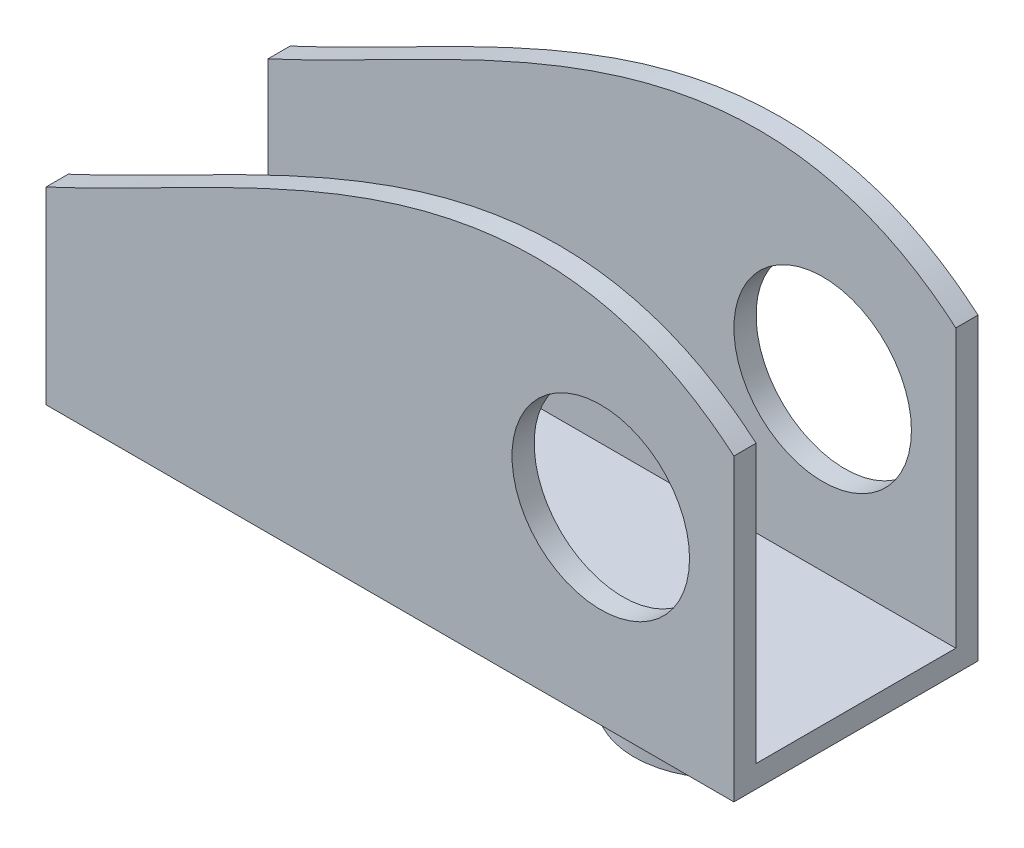
ISO-10303-21;
HEADER;
FILE_DESCRIPTION(('STEP AP214'),'2;1');
FILE_NAME('part.step','',(''),(''),'','','');
FILE_SCHEMA(('AUTOMOTIVE_DESIGN { 1 0 10303 214 1 1 1 1 }'));
ENDSEC;
DATA;
#1=APPLICATION_CONTEXT('core data for automotive mechanical design processes');
#2=APPLICATION_PROTOCOL_DEFINITION('international standard','automotive_design',2000,#1);
#3=PRODUCT_CONTEXT('',#1,'mechanical');
#4=PRODUCT('Part','Part','',(#3));
#5=PRODUCT_RELATED_PRODUCT_CATEGORY('part','',(#4));
#6=PRODUCT_DEFINITION_FORMATION('','',#4);
#7=PRODUCT_DEFINITION_CONTEXT('part definition',#1,'design');
#8=PRODUCT_DEFINITION('design','',#6,#7);
#9=PRODUCT_DEFINITION_SHAPE('','',#8);
#10=(LENGTH_UNIT() NAMED_UNIT(*) SI_UNIT(.MILLI.,.METRE.));
#11=(NAMED_UNIT(*) PLANE_ANGLE_UNIT() SI_UNIT($,.RADIAN.));
#12=(NAMED_UNIT(*) SI_UNIT($,.STERADIAN.) SOLID_ANGLE_UNIT());
#13=UNCERTAINTY_MEASURE_WITH_UNIT(LENGTH_MEASURE(1.E-05),#10,'distance_accuracy_value','');
#14=(GEOMETRIC_REPRESENTATION_CONTEXT(3) GLOBAL_UNCERTAINTY_ASSIGNED_CONTEXT((#13)) GLOBAL_UNIT_ASSIGNED_CONTEXT((#10,
#11,#12)) REPRESENTATION_CONTEXT('',''));
#15=CARTESIAN_POINT('',(0.,0.,0.));
#16=DIRECTION('',(0.,0.,1.));
#17=DIRECTION('',(1.,0.,0.));
#18=AXIS2_PLACEMENT_3D('',#15,#16,#17);
#19=CARTESIAN_POINT('',(0.,10.,0.));
#20=DIRECTION('',(0.,1.,0.));
#21=DIRECTION('',(0.,0.,1.));
#22=AXIS2_PLACEMENT_3D('',#19,#20,#21);
#23=PLANE('',#22);
#24=DIRECTION('',(0.,0.,-1.));
#25=VECTOR('',#24,1.);
#26=CARTESIAN_POINT('',(60.,10.,-10.));
#27=LINE('',#26,#25);
#28=CARTESIAN_POINT('',(60.,10.,-10.));
#29=VERTEX_POINT('',#28);
#30=CARTESIAN_POINT('',(60.,10.,-100.));
#31=VERTEX_POINT('',#30);
#32=EDGE_CURVE('E63',#29,#31,#27,.T.);
#33=ORIENTED_EDGE('',*,*,#32,.T.);
#34=DIRECTION('',(-1.,0.,0.));
#35=VECTOR('',#34,1.);
#36=CARTESIAN_POINT('',(0.,10.,-100.));
#37=LINE('',#36,#35);
#38=CARTESIAN_POINT('',(-250.,10.,-100.));
#39=VERTEX_POINT('',#38);
#40=EDGE_CURVE('E52',#31,#39,#37,.T.);
#41=ORIENTED_EDGE('',*,*,#40,.T.);
#42=DIRECTION('',(0.,0.,1.));
#43=VECTOR('',#42,1.);
#44=CARTESIAN_POINT('',(-250.,10.,-10.));
#45=LINE('',#44,#43);
#46=CARTESIAN_POINT('',(-250.,10.,-10.));
#47=VERTEX_POINT('',#46);
#48=EDGE_CURVE('E231',#39,#47,#45,.T.);
#49=ORIENTED_EDGE('',*,*,#48,.T.);
#50=DIRECTION('',(1.,0.,0.));
#51=VECTOR('',#50,1.);
#52=CARTESIAN_POINT('',(60.,10.,-10.));
#53=LINE('',#52,#51);
#54=EDGE_CURVE('E226',#47,#29,#53,.T.);
#55=ORIENTED_EDGE('',*,*,#54,.T.);
#56=EDGE_LOOP('',(#33,#41,#49,#55));
#57=FACE_BOUND('',#56,.T.);
#58=ADVANCED_FACE('F43',(#57),#23,.T.);
#59=CARTESIAN_POINT('',(0.,0.,-10.));
#60=DIRECTION('',(0.,0.,1.));
#61=DIRECTION('',(1.,0.,0.));
#62=AXIS2_PLACEMENT_3D('',#59,#60,#61);
#63=PLANE('',#62);
#64=CARTESIAN_POINT('',(0.,85.,-10.));
#65=DIRECTION('',(0.,0.,1.));
#66=DIRECTION('',(1.,0.,0.));
#67=AXIS2_PLACEMENT_3D('',#64,#65,#66);
#68=CIRCLE('',#67,40.);
#69=CARTESIAN_POINT('',(40.,85.,-10.));
#70=VERTEX_POINT('',#69);
#71=EDGE_CURVE('E229',#70,#70,#68,.T.);
#72=ORIENTED_EDGE('',*,*,#71,.T.);
#73=EDGE_LOOP('',(#72));
#74=FACE_BOUND('',#73,.T.);
#75=ORIENTED_EDGE('',*,*,#54,.F.);
#76=DIRECTION('',(0.,1.,0.));
#77=VECTOR('',#76,1.);
#78=CARTESIAN_POINT('',(-250.,0.,-10.));
#79=LINE('',#78,#77);
#80=CARTESIAN_POINT('',(-250.,85.,-10.));
#81=VERTEX_POINT('',#80);
#82=EDGE_CURVE('E214',#47,#81,#79,.T.);
#83=ORIENTED_EDGE('',*,*,#82,.T.);
#84=CARTESIAN_POINT('',(-250.,85.,-10.));
#85=CARTESIAN_POINT('',(-153.801303074446,129.310151565496,-10.));
#86=CARTESIAN_POINT('',(-33.7522028653612,215.042079274667,-10.));
#87=CARTESIAN_POINT('',(60.,135.,-10.));
#88=B_SPLINE_CURVE_WITH_KNOTS('',3,(#84,#85,#86,#87),.UNSPECIFIED.,.F.,.F.,(4,4),(0.,1.),.UNSPECIFIED.);
#89=CARTESIAN_POINT('',(60.,135.,-10.));
#90=VERTEX_POINT('',#89);
#91=EDGE_CURVE('E207',#81,#90,#88,.T.);
#92=ORIENTED_EDGE('',*,*,#91,.T.);
#93=DIRECTION('',(0.,1.,0.));
#94=VECTOR('',#93,1.);
#95=CARTESIAN_POINT('',(60.,0.,-10.));
#96=LINE('',#95,#94);
#97=EDGE_CURVE('E211',#29,#90,#96,.T.);
#98=ORIENTED_EDGE('',*,*,#97,.F.);
#99=EDGE_LOOP('',(#75,#83,#92,#98));
#100=FACE_BOUND('',#99,.T.);
#101=ADVANCED_FACE('F155',(#74,#100),#63,.F.);
#102=DIRECTION('',(0.,0.,1.));
#103=VECTOR('',#102,1.);
#104=SURFACE_OF_LINEAR_EXTRUSION('',#88,#103);
#105=CARTESIAN_POINT('',(-250.,85.,0.));
#106=CARTESIAN_POINT('',(-153.801303074446,129.310151565496,0.));
#107=CARTESIAN_POINT('',(-33.7522028653612,215.042079274667,0.));
#108=CARTESIAN_POINT('',(60.,135.,0.));
#109=B_SPLINE_CURVE_WITH_KNOTS('',3,(#105,#106,#107,#108),.UNSPECIFIED.,.F.,.F.,(4,4),(0.,1.),.UNSPECIFIED.);
#110=CARTESIAN_POINT('',(-250.,85.,0.));
#111=VERTEX_POINT('',#110);
#112=CARTESIAN_POINT('',(60.,135.,0.));
#113=VERTEX_POINT('',#112);
#114=EDGE_CURVE('E199',#111,#113,#109,.T.);
#115=ORIENTED_EDGE('',*,*,#114,.T.);
#116=DIRECTION('',(0.,0.,1.));
#117=VECTOR('',#116,1.);
#118=CARTESIAN_POINT('',(60.,135.,-10.));
#119=LINE('',#118,#117);
#120=EDGE_CURVE('E208',#90,#113,#119,.T.);
#121=ORIENTED_EDGE('',*,*,#120,.F.);
#122=ORIENTED_EDGE('',*,*,#91,.F.);
#123=DIRECTION('',(0.,0.,1.));
#124=VECTOR('',#123,1.);
#125=CARTESIAN_POINT('',(-250.,85.,-10.));
#126=LINE('',#125,#124);
#127=EDGE_CURVE('E188',#81,#111,#126,.T.);
#128=ORIENTED_EDGE('',*,*,#127,.T.);
#129=EDGE_LOOP('',(#115,#121,#122,#128));
#130=FACE_BOUND('',#129,.T.);
#131=ADVANCED_FACE('F45',(#130),#104,.F.);
#132=CARTESIAN_POINT('',(60.,0.,-10.));
#133=DIRECTION('',(1.,0.,0.));
#134=DIRECTION('',(0.,0.,-1.));
#135=AXIS2_PLACEMENT_3D('',#132,#133,#134);
#136=PLANE('',#135);
#137=DIRECTION('',(0.,1.,0.));
#138=VECTOR('',#137,1.);
#139=CARTESIAN_POINT('',(60.,0.,-100.));
#140=LINE('',#139,#138);
#141=CARTESIAN_POINT('',(60.,135.,-100.));
#142=VERTEX_POINT('',#141);
#143=EDGE_CURVE('E107',#31,#142,#140,.T.);
#144=ORIENTED_EDGE('',*,*,#143,.F.);
#145=ORIENTED_EDGE('',*,*,#32,.F.);
#146=ORIENTED_EDGE('',*,*,#97,.T.);
#147=ORIENTED_EDGE('',*,*,#120,.T.);
#148=DIRECTION('',(0.,1.,0.));
#149=VECTOR('',#148,1.);
#150=CARTESIAN_POINT('',(60.,0.,0.));
#151=LINE('',#150,#149);
#152=CARTESIAN_POINT('',(60.,0.,0.));
#153=VERTEX_POINT('',#152);
#154=EDGE_CURVE('E195',#153,#113,#151,.T.);
#155=ORIENTED_EDGE('',*,*,#154,.F.);
#156=DIRECTION('',(0.,0.,1.));
#157=VECTOR('',#156,1.);
#158=CARTESIAN_POINT('',(60.,0.,-10.));
#159=LINE('',#158,#157);
#160=CARTESIAN_POINT('',(60.,0.,-110.));
#161=VERTEX_POINT('',#160);
#162=EDGE_CURVE('E187',#161,#153,#159,.T.);
#163=ORIENTED_EDGE('',*,*,#162,.F.);
#164=DIRECTION('',(0.,-1.,0.));
#165=VECTOR('',#164,1.);
#166=CARTESIAN_POINT('',(60.,10.,-110.));
#167=LINE('',#166,#165);
#168=CARTESIAN_POINT('',(60.,135.,-110.));
#169=VERTEX_POINT('',#168);
#170=EDGE_CURVE('E120',#169,#161,#167,.T.);
#171=ORIENTED_EDGE('',*,*,#170,.F.);
#172=DIRECTION('',(0.,0.,-1.));
#173=VECTOR('',#172,1.);
#174=CARTESIAN_POINT('',(60.,135.,-100.));
#175=LINE('',#174,#173);
#176=EDGE_CURVE('E117',#142,#169,#175,.T.);
#177=ORIENTED_EDGE('',*,*,#176,.F.);
#178=EDGE_LOOP('',(#144,#145,#146,#147,#155,#163,#171,#177));
#179=FACE_BOUND('',#178,.T.);
#180=ADVANCED_FACE('F118',(#179),#136,.T.);
#181=CARTESIAN_POINT('',(0.,0.,-10.));
#182=DIRECTION('',(0.,1.,0.));
#183=DIRECTION('',(-1.,0.,0.));
#184=AXIS2_PLACEMENT_3D('',#181,#182,#183);
#185=PLANE('',#184);
#186=CARTESIAN_POINT('',(0.,0.,-55.));
#187=DIRECTION('',(0.,1.,0.));
#188=DIRECTION('',(-1.,0.,0.));
#189=AXIS2_PLACEMENT_3D('',#186,#187,#188);
#190=CIRCLE('',#189,40.);
#191=CARTESIAN_POINT('',(-40.,0.,-55.));
#192=VERTEX_POINT('',#191);
#193=EDGE_CURVE('E11',#192,#192,#190,.F.);
#194=ORIENTED_EDGE('',*,*,#193,.F.);
#195=EDGE_LOOP('',(#194));
#196=FACE_BOUND('',#195,.T.);
#197=ORIENTED_EDGE('',*,*,#162,.T.);
#198=DIRECTION('',(-1.,0.,0.));
#199=VECTOR('',#198,1.);
#200=CARTESIAN_POINT('',(0.,0.,0.));
#201=LINE('',#200,#199);
#202=CARTESIAN_POINT('',(-250.,0.,0.));
#203=VERTEX_POINT('',#202);
#204=EDGE_CURVE('E191',#153,#203,#201,.T.);
#205=ORIENTED_EDGE('',*,*,#204,.T.);
#206=DIRECTION('',(0.,0.,1.));
#207=VECTOR('',#206,1.);
#208=CARTESIAN_POINT('',(-250.,0.,-10.));
#209=LINE('',#208,#207);
#210=CARTESIAN_POINT('',(-250.,0.,-110.));
#211=VERTEX_POINT('',#210);
#212=EDGE_CURVE('E177',#211,#203,#209,.T.);
#213=ORIENTED_EDGE('',*,*,#212,.F.);
#214=DIRECTION('',(-1.,0.,0.));
#215=VECTOR('',#214,1.);
#216=CARTESIAN_POINT('',(60.,0.,-110.));
#217=LINE('',#216,#215);
#218=EDGE_CURVE('E227',#161,#211,#217,.T.);
#219=ORIENTED_EDGE('',*,*,#218,.F.);
#220=EDGE_LOOP('',(#197,#205,#213,#219));
#221=FACE_BOUND('',#220,.T.);
#222=ADVANCED_FACE('F169',(#196,#221),#185,.F.);
#223=CARTESIAN_POINT('',(-250.,0.,-10.));
#224=DIRECTION('',(1.,0.,0.));
#225=DIRECTION('',(0.,0.,-1.));
#226=AXIS2_PLACEMENT_3D('',#223,#224,#225);
#227=PLANE('',#226);
#228=ORIENTED_EDGE('',*,*,#212,.T.);
#229=DIRECTION('',(0.,1.,0.));
#230=VECTOR('',#229,1.);
#231=CARTESIAN_POINT('',(-250.,0.,0.));
#232=LINE('',#231,#230);
#233=EDGE_CURVE('E181',#203,#111,#232,.T.);
#234=ORIENTED_EDGE('',*,*,#233,.T.);
#235=ORIENTED_EDGE('',*,*,#127,.F.);
#236=ORIENTED_EDGE('',*,*,#82,.F.);
#237=ORIENTED_EDGE('',*,*,#48,.F.);
#238=DIRECTION('',(0.,1.,0.));
#239=VECTOR('',#238,1.);
#240=CARTESIAN_POINT('',(-250.,0.,-100.));
#241=LINE('',#240,#239);
#242=CARTESIAN_POINT('',(-250.,85.,-100.));
#243=VERTEX_POINT('',#242);
#244=EDGE_CURVE('E114',#39,#243,#241,.T.);
#245=ORIENTED_EDGE('',*,*,#244,.T.);
#246=DIRECTION('',(0.,0.,-1.));
#247=VECTOR('',#246,1.);
#248=CARTESIAN_POINT('',(-250.,85.,-100.));
#249=LINE('',#248,#247);
#250=CARTESIAN_POINT('',(-250.,85.,-110.));
#251=VERTEX_POINT('',#250);
#252=EDGE_CURVE('E124',#243,#251,#249,.T.);
#253=ORIENTED_EDGE('',*,*,#252,.T.);
#254=DIRECTION('',(0.,-1.,0.));
#255=VECTOR('',#254,1.);
#256=CARTESIAN_POINT('',(-250.,10.,-110.));
#257=LINE('',#256,#255);
#258=EDGE_CURVE('E183',#251,#211,#257,.T.);
#259=ORIENTED_EDGE('',*,*,#258,.T.);
#260=EDGE_LOOP('',(#228,#234,#235,#236,#237,#245,#253,#259));
#261=FACE_BOUND('',#260,.T.);
#262=ADVANCED_FACE('F165',(#261),#227,.F.);
#263=CARTESIAN_POINT('',(0.,0.,0.));
#264=DIRECTION('',(0.,0.,1.));
#265=DIRECTION('',(1.,0.,0.));
#266=AXIS2_PLACEMENT_3D('',#263,#264,#265);
#267=PLANE('',#266);
#268=CARTESIAN_POINT('',(0.,85.,0.));
#269=DIRECTION('',(0.,0.,1.));
#270=DIRECTION('',(1.,0.,0.));
#271=AXIS2_PLACEMENT_3D('',#268,#269,#270);
#272=CIRCLE('',#271,40.);
#273=CARTESIAN_POINT('',(40.,85.,0.));
#274=VERTEX_POINT('',#273);
#275=EDGE_CURVE('E234',#274,#274,#272,.T.);
#276=ORIENTED_EDGE('',*,*,#275,.F.);
#277=EDGE_LOOP('',(#276));
#278=FACE_BOUND('',#277,.T.);
#279=ORIENTED_EDGE('',*,*,#114,.F.);
#280=ORIENTED_EDGE('',*,*,#233,.F.);
#281=ORIENTED_EDGE('',*,*,#204,.F.);
#282=ORIENTED_EDGE('',*,*,#154,.T.);
#283=EDGE_LOOP('',(#279,#280,#281,#282));
#284=FACE_BOUND('',#283,.T.);
#285=ADVANCED_FACE('F158',(#278,#284),#267,.T.);
#286=CARTESIAN_POINT('',(60.,10.,-110.));
#287=DIRECTION('',(0.,0.,1.));
#288=DIRECTION('',(1.,0.,0.));
#289=AXIS2_PLACEMENT_3D('',#286,#287,#288);
#290=PLANE('',#289);
#291=CARTESIAN_POINT('',(0.,85.,-110.));
#292=DIRECTION('',(0.,0.,1.));
#293=DIRECTION('',(1.,0.,0.));
#294=AXIS2_PLACEMENT_3D('',#291,#292,#293);
#295=CIRCLE('',#294,40.);
#296=CARTESIAN_POINT('',(40.,85.,-110.));
#297=VERTEX_POINT('',#296);
#298=EDGE_CURVE('E137',#297,#297,#295,.T.);
#299=ORIENTED_EDGE('',*,*,#298,.T.);
#300=EDGE_LOOP('',(#299));
#301=FACE_BOUND('',#300,.T.);
#302=ORIENTED_EDGE('',*,*,#218,.T.);
#303=ORIENTED_EDGE('',*,*,#258,.F.);
#304=CARTESIAN_POINT('',(-250.,85.,-110.));
#305=CARTESIAN_POINT('',(-153.801303074446,129.310151565496,-110.));
#306=CARTESIAN_POINT('',(-33.7522028653612,215.042079274667,-110.));
#307=CARTESIAN_POINT('',(60.,135.,-110.));
#308=B_SPLINE_CURVE_WITH_KNOTS('',3,(#304,#305,#306,#307),.UNSPECIFIED.,.F.,.F.,(4,4),(0.,1.),.UNSPECIFIED.);
#309=EDGE_CURVE('E129',#251,#169,#308,.T.);
#310=ORIENTED_EDGE('',*,*,#309,.T.);
#311=ORIENTED_EDGE('',*,*,#170,.T.);
#312=EDGE_LOOP('',(#302,#303,#310,#311));
#313=FACE_BOUND('',#312,.T.);
#314=ADVANCED_FACE('F151',(#301,#313),#290,.F.);
#315=CARTESIAN_POINT('',(0.,85.,-10.));
#316=DIRECTION('',(0.,0.,1.));
#317=DIRECTION('',(1.,0.,0.));
#318=AXIS2_PLACEMENT_3D('',#315,#316,#317);
#319=CYLINDRICAL_SURFACE('',#318,40.);
#320=ORIENTED_EDGE('',*,*,#71,.F.);
#321=EDGE_LOOP('',(#320));
#322=FACE_BOUND('',#321,.T.);
#323=ORIENTED_EDGE('',*,*,#275,.T.);
#324=EDGE_LOOP('',(#323));
#325=FACE_BOUND('',#324,.T.);
#326=ADVANCED_FACE('F147',(#322,#325),#319,.F.);
#327=CARTESIAN_POINT('',(-250.,85.,-100.));
#328=CARTESIAN_POINT('',(-153.801303074446,129.310151565496,-100.));
#329=CARTESIAN_POINT('',(-33.7522028653612,215.042079274667,-100.));
#330=CARTESIAN_POINT('',(60.,135.,-100.));
#331=B_SPLINE_CURVE_WITH_KNOTS('',3,(#327,#328,#329,#330),.UNSPECIFIED.,.F.,.F.,(4,4),(0.,1.),.UNSPECIFIED.);
#332=DIRECTION('',(0.,0.,-1.));
#333=VECTOR('',#332,1.);
#334=SURFACE_OF_LINEAR_EXTRUSION('',#331,#333);
#335=ORIENTED_EDGE('',*,*,#309,.F.);
#336=ORIENTED_EDGE('',*,*,#252,.F.);
#337=EDGE_CURVE('E112',#243,#142,#331,.T.);
#338=ORIENTED_EDGE('',*,*,#337,.T.);
#339=ORIENTED_EDGE('',*,*,#176,.T.);
#340=EDGE_LOOP('',(#335,#336,#338,#339));
#341=FACE_BOUND('',#340,.T.);
#342=ADVANCED_FACE('F127',(#341),#334,.T.);
#343=CARTESIAN_POINT('',(0.,0.,-100.));
#344=DIRECTION('',(0.,0.,-1.));
#345=DIRECTION('',(1.,0.,0.));
#346=AXIS2_PLACEMENT_3D('',#343,#344,#345);
#347=PLANE('',#346);
#348=CARTESIAN_POINT('',(0.,85.,-100.));
#349=DIRECTION('',(0.,0.,1.));
#350=DIRECTION('',(1.,0.,0.));
#351=AXIS2_PLACEMENT_3D('',#348,#349,#350);
#352=CIRCLE('',#351,40.);
#353=CARTESIAN_POINT('',(40.,85.,-100.));
#354=VERTEX_POINT('',#353);
#355=EDGE_CURVE('E131',#354,#354,#352,.T.);
#356=ORIENTED_EDGE('',*,*,#355,.F.);
#357=EDGE_LOOP('',(#356));
#358=FACE_BOUND('',#357,.T.);
#359=ORIENTED_EDGE('',*,*,#40,.F.);
#360=ORIENTED_EDGE('',*,*,#143,.T.);
#361=ORIENTED_EDGE('',*,*,#337,.F.);
#362=ORIENTED_EDGE('',*,*,#244,.F.);
#363=EDGE_LOOP('',(#359,#360,#361,#362));
#364=FACE_BOUND('',#363,.T.);
#365=ADVANCED_FACE('F109',(#358,#364),#347,.F.);
#366=CARTESIAN_POINT('',(0.,85.,-100.));
#367=DIRECTION('',(0.,0.,-1.));
#368=DIRECTION('',(-1.,0.,0.));
#369=AXIS2_PLACEMENT_3D('',#366,#367,#368);
#370=CYLINDRICAL_SURFACE('',#369,40.);
#371=ORIENTED_EDGE('',*,*,#355,.T.);
#372=EDGE_LOOP('',(#371));
#373=FACE_BOUND('',#372,.T.);
#374=ORIENTED_EDGE('',*,*,#298,.F.);
#375=EDGE_LOOP('',(#374));
#376=FACE_BOUND('',#375,.T.);
#377=ADVANCED_FACE('F317',(#373,#376),#370,.F.);
#378=CARTESIAN_POINT('',(0.,-20.,-55.));
#379=DIRECTION('',(0.,1.,0.));
#380=DIRECTION('',(-1.,0.,0.));
#381=AXIS2_PLACEMENT_3D('',#378,#379,#380);
#382=CYLINDRICAL_SURFACE('',#381,40.);
#383=CARTESIAN_POINT('',(0.,-20.,-55.));
#384=DIRECTION('',(0.,-1.,0.));
#385=DIRECTION('',(1.,0.,0.));
#386=AXIS2_PLACEMENT_3D('',#383,#384,#385);
#387=CIRCLE('',#386,40.);
#388=CARTESIAN_POINT('',(40.,-20.,-55.));
#389=VERTEX_POINT('',#388);
#390=EDGE_CURVE('E356',#389,#389,#387,.T.);
#391=ORIENTED_EDGE('',*,*,#390,.F.);
#392=EDGE_LOOP('',(#391));
#393=FACE_BOUND('',#392,.T.);
#394=ORIENTED_EDGE('',*,*,#193,.T.);
#395=EDGE_LOOP('',(#394));
#396=FACE_BOUND('',#395,.T.);
#397=ADVANCED_FACE('F332',(#393,#396),#382,.T.);
#398=CARTESIAN_POINT('',(0.,-20.,-55.));
#399=DIRECTION('',(0.,-1.,0.));
#400=DIRECTION('',(1.,0.,0.));
#401=AXIS2_PLACEMENT_3D('',#398,#399,#400);
#402=PLANE('',#401);
#403=ORIENTED_EDGE('',*,*,#390,.T.);
#404=EDGE_LOOP('',(#403));
#405=FACE_BOUND('',#404,.T.);
#406=ADVANCED_FACE('F341',(#405),#402,.T.);
#407=CLOSED_SHELL('',(#58,#101,#131,#180,#222,#262,#285,#314,#326,#342,#365,#377,#397,#406));
#408=MANIFOLD_SOLID_BREP('B2',#407);
#409=ADVANCED_BREP_SHAPE_REPRESENTATION('',(#18,#408),#14);
#410=SHAPE_DEFINITION_REPRESENTATION(#9,#409);
ENDSEC;
END-ISO-10303-21;
